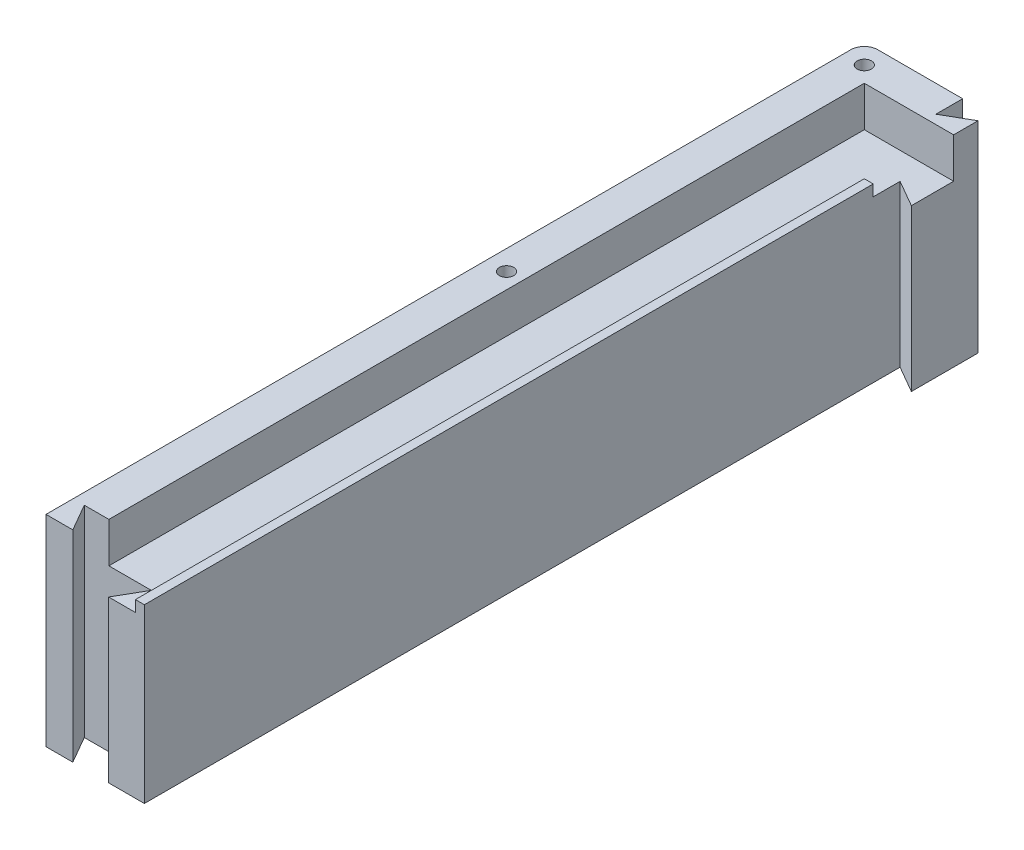
ISO-10303-21;
HEADER;
FILE_DESCRIPTION(('STEP AP214'),'2;1');
FILE_NAME('part.step','',(''),(''),'','','');
FILE_SCHEMA(('AUTOMOTIVE_DESIGN { 1 0 10303 214 1 1 1 1 }'));
ENDSEC;
DATA;
#1=APPLICATION_CONTEXT('core data for automotive mechanical design processes');
#2=APPLICATION_PROTOCOL_DEFINITION('international standard','automotive_design',2000,#1);
#3=PRODUCT_CONTEXT('',#1,'mechanical');
#4=PRODUCT('Part','Part','',(#3));
#5=PRODUCT_RELATED_PRODUCT_CATEGORY('part','',(#4));
#6=PRODUCT_DEFINITION_FORMATION('','',#4);
#7=PRODUCT_DEFINITION_CONTEXT('part definition',#1,'design');
#8=PRODUCT_DEFINITION('design','',#6,#7);
#9=PRODUCT_DEFINITION_SHAPE('','',#8);
#10=(LENGTH_UNIT() NAMED_UNIT(*) SI_UNIT(.MILLI.,.METRE.));
#11=(NAMED_UNIT(*) PLANE_ANGLE_UNIT() SI_UNIT($,.RADIAN.));
#12=(NAMED_UNIT(*) SI_UNIT($,.STERADIAN.) SOLID_ANGLE_UNIT());
#13=UNCERTAINTY_MEASURE_WITH_UNIT(LENGTH_MEASURE(1.E-05),#10,'distance_accuracy_value','');
#14=(GEOMETRIC_REPRESENTATION_CONTEXT(3) GLOBAL_UNCERTAINTY_ASSIGNED_CONTEXT((#13)) GLOBAL_UNIT_ASSIGNED_CONTEXT((#10,
#11,#12)) REPRESENTATION_CONTEXT('',''));
#15=CARTESIAN_POINT('',(0.,0.,0.));
#16=DIRECTION('',(0.,0.,1.));
#17=DIRECTION('',(1.,0.,0.));
#18=AXIS2_PLACEMENT_3D('',#15,#16,#17);
#19=CARTESIAN_POINT('',(0.,45.,0.));
#20=DIRECTION('',(0.,1.,0.));
#21=DIRECTION('',(0.,0.,1.));
#22=AXIS2_PLACEMENT_3D('',#19,#20,#21);
#23=PLANE('',#22);
#24=CARTESIAN_POINT('',(-3.53553390593273,45.,-273.535533905933));
#25=DIRECTION('',(0.,1.,0.));
#26=DIRECTION('',(0.,0.,1.));
#27=AXIS2_PLACEMENT_3D('',#24,#25,#26);
#28=CIRCLE('',#27,1.6);
#29=CARTESIAN_POINT('',(-3.53553390593273,45.,-271.935533905933));
#30=VERTEX_POINT('',#29);
#31=EDGE_CURVE('E201',#30,#30,#28,.T.);
#32=ORIENTED_EDGE('',*,*,#31,.F.);
#33=EDGE_LOOP('',(#32));
#34=FACE_BOUND('',#33,.T.);
#35=CARTESIAN_POINT('',(-3.53553390593274,45.,-353.535533905933));
#36=DIRECTION('',(0.,1.,0.));
#37=DIRECTION('',(0.,0.,1.));
#38=AXIS2_PLACEMENT_3D('',#35,#36,#37);
#39=CIRCLE('',#38,1.59999999999999);
#40=CARTESIAN_POINT('',(-3.53553390593274,45.,-351.935533905933));
#41=VERTEX_POINT('',#40);
#42=EDGE_CURVE('E285',#41,#41,#39,.T.);
#43=ORIENTED_EDGE('',*,*,#42,.F.);
#44=EDGE_LOOP('',(#43));
#45=FACE_BOUND('',#44,.T.);
#46=CARTESIAN_POINT('',(-5.,45.,-355.));
#47=DIRECTION('',(0.,1.,0.));
#48=DIRECTION('',(0.,0.,1.));
#49=AXIS2_PLACEMENT_3D('',#46,#47,#48);
#50=CIRCLE('',#49,3.00000000000004);
#51=CARTESIAN_POINT('',(-5.,45.,-358.));
#52=VERTEX_POINT('',#51);
#53=CARTESIAN_POINT('',(-8.00000000000003,45.,-355.));
#54=VERTEX_POINT('',#53);
#55=EDGE_CURVE('E198',#52,#54,#50,.T.);
#56=ORIENTED_EDGE('',*,*,#55,.T.);
#57=DIRECTION('',(0.,0.,1.));
#58=VECTOR('',#57,1.);
#59=CARTESIAN_POINT('',(-8.,45.,0.));
#60=LINE('',#59,#58);
#61=CARTESIAN_POINT('',(-8.,45.,-175.));
#62=VERTEX_POINT('',#61);
#63=EDGE_CURVE('E207',#54,#62,#60,.T.);
#64=ORIENTED_EDGE('',*,*,#63,.T.);
#65=DIRECTION('',(1.,0.,0.));
#66=VECTOR('',#65,1.);
#67=CARTESIAN_POINT('',(-6.07153216591882E-13,45.,-175.));
#68=LINE('',#67,#66);
#69=CARTESIAN_POINT('',(-2.,45.,-175.));
#70=VERTEX_POINT('',#69);
#71=EDGE_CURVE('E273',#62,#70,#68,.T.);
#72=ORIENTED_EDGE('',*,*,#71,.T.);
#73=DIRECTION('',(0.499999999999997,0.,0.86602540378444));
#74=VECTOR('',#73,1.);
#75=CARTESIAN_POINT('',(74.2772228311381,45.,-42.8839745962151));
#76=LINE('',#75,#74);
#77=CARTESIAN_POINT('',(-5.49999999999999,45.,-181.062177826491));
#78=VERTEX_POINT('',#77);
#79=EDGE_CURVE('E277',#78,#70,#76,.T.);
#80=ORIENTED_EDGE('',*,*,#79,.F.);
#81=DIRECTION('',(-1.,0.,0.));
#82=VECTOR('',#81,1.);
#83=CARTESIAN_POINT('',(0.,45.,-181.062177826491));
#84=LINE('',#83,#82);
#85=CARTESIAN_POINT('',(0.,45.,-181.062177826491));
#86=VERTEX_POINT('',#85);
#87=EDGE_CURVE('E263',#86,#78,#84,.T.);
#88=ORIENTED_EDGE('',*,*,#87,.F.);
#89=DIRECTION('',(0.,0.,-1.));
#90=VECTOR('',#89,1.);
#91=CARTESIAN_POINT('',(0.,45.,0.));
#92=LINE('',#91,#90);
#93=CARTESIAN_POINT('',(0.,45.,-350.));
#94=VERTEX_POINT('',#93);
#95=EDGE_CURVE('E305',#86,#94,#92,.T.);
#96=ORIENTED_EDGE('',*,*,#95,.T.);
#97=DIRECTION('',(1.,0.,0.));
#98=VECTOR('',#97,1.);
#99=CARTESIAN_POINT('',(0.,45.,-350.));
#100=LINE('',#99,#98);
#101=CARTESIAN_POINT('',(19.9755752861127,45.,-350.));
#102=VERTEX_POINT('',#101);
#103=EDGE_CURVE('E307',#94,#102,#100,.T.);
#104=ORIENTED_EDGE('',*,*,#103,.T.);
#105=DIRECTION('',(0.,0.,-1.));
#106=VECTOR('',#105,1.);
#107=CARTESIAN_POINT('',(19.9755752861127,45.,0.));
#108=LINE('',#107,#106);
#109=CARTESIAN_POINT('',(19.9755752861127,45.,-355.45));
#110=VERTEX_POINT('',#109);
#111=EDGE_CURVE('E175',#102,#110,#108,.T.);
#112=ORIENTED_EDGE('',*,*,#111,.T.);
#113=DIRECTION('',(-0.866025403784486,0.,0.499999999999919));
#114=VECTOR('',#113,1.);
#115=CARTESIAN_POINT('',(-148.920471066046,45.,-257.937822173539));
#116=LINE('',#115,#114);
#117=CARTESIAN_POINT('',(13.9999999999988,45.,-352.));
#118=VERTEX_POINT('',#117);
#119=EDGE_CURVE('E280',#110,#118,#116,.T.);
#120=ORIENTED_EDGE('',*,*,#119,.T.);
#121=DIRECTION('',(0.,0.,1.));
#122=VECTOR('',#121,1.);
#123=CARTESIAN_POINT('',(14.0000000000012,45.,0.));
#124=LINE('',#123,#122);
#125=CARTESIAN_POINT('',(13.9999999999987,45.,-358.));
#126=VERTEX_POINT('',#125);
#127=EDGE_CURVE('E275',#126,#118,#124,.T.);
#128=ORIENTED_EDGE('',*,*,#127,.F.);
#129=DIRECTION('',(-1.,0.,0.));
#130=VECTOR('',#129,1.);
#131=CARTESIAN_POINT('',(0.,45.,-358.));
#132=LINE('',#131,#130);
#133=EDGE_CURVE('E54',#126,#52,#132,.T.);
#134=ORIENTED_EDGE('',*,*,#133,.T.);
#135=EDGE_LOOP('',(#56,#64,#72,#80,#88,#96,#104,#112,#120,#128,#134));
#136=FACE_BOUND('',#135,.T.);
#137=ADVANCED_FACE('F38',(#34,#45,#136),#23,.T.);
#138=CARTESIAN_POINT('',(0.,0.,0.));
#139=DIRECTION('',(0.,1.,0.));
#140=DIRECTION('',(0.,0.,1.));
#141=AXIS2_PLACEMENT_3D('',#138,#139,#140);
#142=PLANE('',#141);
#143=CARTESIAN_POINT('',(-3.53553390593273,0.,-273.535533905933));
#144=DIRECTION('',(0.,1.,0.));
#145=DIRECTION('',(0.,0.,1.));
#146=AXIS2_PLACEMENT_3D('',#143,#144,#145);
#147=CIRCLE('',#146,1.6);
#148=CARTESIAN_POINT('',(-3.53553390593273,0.,-271.935533905933));
#149=VERTEX_POINT('',#148);
#150=EDGE_CURVE('E42',#149,#149,#147,.T.);
#151=ORIENTED_EDGE('',*,*,#150,.T.);
#152=EDGE_LOOP('',(#151));
#153=FACE_BOUND('',#152,.T.);
#154=CARTESIAN_POINT('',(-3.53553390593274,0.,-353.535533905933));
#155=DIRECTION('',(0.,1.,0.));
#156=DIRECTION('',(0.,0.,1.));
#157=AXIS2_PLACEMENT_3D('',#154,#155,#156);
#158=CIRCLE('',#157,1.59999999999999);
#159=CARTESIAN_POINT('',(-3.53553390593274,0.,-351.935533905933));
#160=VERTEX_POINT('',#159);
#161=EDGE_CURVE('E288',#160,#160,#158,.T.);
#162=ORIENTED_EDGE('',*,*,#161,.T.);
#163=EDGE_LOOP('',(#162));
#164=FACE_BOUND('',#163,.T.);
#165=DIRECTION('',(0.,0.,1.));
#166=VECTOR('',#165,1.);
#167=CARTESIAN_POINT('',(-8.,0.,0.));
#168=LINE('',#167,#166);
#169=CARTESIAN_POINT('',(-8.00000000000003,0.,-355.));
#170=VERTEX_POINT('',#169);
#171=CARTESIAN_POINT('',(-8.,0.,-175.));
#172=VERTEX_POINT('',#171);
#173=EDGE_CURVE('E216',#170,#172,#168,.T.);
#174=ORIENTED_EDGE('',*,*,#173,.F.);
#175=CARTESIAN_POINT('',(-5.,0.,-355.));
#176=DIRECTION('',(0.,1.,0.));
#177=DIRECTION('',(0.,0.,1.));
#178=AXIS2_PLACEMENT_3D('',#175,#176,#177);
#179=CIRCLE('',#178,3.00000000000004);
#180=CARTESIAN_POINT('',(-5.,0.,-358.));
#181=VERTEX_POINT('',#180);
#182=EDGE_CURVE('E11',#181,#170,#179,.T.);
#183=ORIENTED_EDGE('',*,*,#182,.F.);
#184=DIRECTION('',(-1.,0.,0.));
#185=VECTOR('',#184,1.);
#186=CARTESIAN_POINT('',(0.,0.,-358.));
#187=LINE('',#186,#185);
#188=CARTESIAN_POINT('',(13.9999999999987,0.,-358.));
#189=VERTEX_POINT('',#188);
#190=EDGE_CURVE('E213',#189,#181,#187,.T.);
#191=ORIENTED_EDGE('',*,*,#190,.F.);
#192=DIRECTION('',(0.,0.,-1.));
#193=VECTOR('',#192,1.);
#194=CARTESIAN_POINT('',(14.0000000000012,0.,0.));
#195=LINE('',#194,#193);
#196=CARTESIAN_POINT('',(13.9999999999988,0.,-352.));
#197=VERTEX_POINT('',#196);
#198=EDGE_CURVE('E231',#197,#189,#195,.T.);
#199=ORIENTED_EDGE('',*,*,#198,.F.);
#200=DIRECTION('',(0.866025403784486,0.,-0.499999999999919));
#201=VECTOR('',#200,1.);
#202=CARTESIAN_POINT('',(-148.920471066046,0.,-257.937822173539));
#203=LINE('',#202,#201);
#204=CARTESIAN_POINT('',(19.9755752861127,0.,-355.45));
#205=VERTEX_POINT('',#204);
#206=EDGE_CURVE('E235',#197,#205,#203,.T.);
#207=ORIENTED_EDGE('',*,*,#206,.T.);
#208=DIRECTION('',(0.,0.,1.));
#209=VECTOR('',#208,1.);
#210=CARTESIAN_POINT('',(19.9755752861127,0.,0.));
#211=LINE('',#210,#209);
#212=CARTESIAN_POINT('',(19.9755752861127,0.,-340.55));
#213=VERTEX_POINT('',#212);
#214=EDGE_CURVE('E239',#205,#213,#211,.T.);
#215=ORIENTED_EDGE('',*,*,#214,.T.);
#216=DIRECTION('',(-0.866025403784487,0.,-0.499999999999916));
#217=VECTOR('',#216,1.);
#218=CARTESIAN_POINT('',(152.456369450905,0.,-264.062177826519));
#219=LINE('',#218,#217);
#220=CARTESIAN_POINT('',(13.9999999999988,0.,-344.));
#221=VERTEX_POINT('',#220);
#222=EDGE_CURVE('E236',#213,#221,#219,.T.);
#223=ORIENTED_EDGE('',*,*,#222,.T.);
#224=DIRECTION('',(0.,0.,-1.));
#225=VECTOR('',#224,1.);
#226=CARTESIAN_POINT('',(14.,0.,-336.));
#227=LINE('',#226,#225);
#228=CARTESIAN_POINT('',(14.,0.,-175.));
#229=VERTEX_POINT('',#228);
#230=EDGE_CURVE('E283',#229,#221,#227,.T.);
#231=ORIENTED_EDGE('',*,*,#230,.F.);
#232=DIRECTION('',(-1.,0.,0.));
#233=VECTOR('',#232,1.);
#234=CARTESIAN_POINT('',(-6.07153216591882E-13,0.,-175.));
#235=LINE('',#234,#233);
#236=CARTESIAN_POINT('',(6.00000000000002,0.,-175.));
#237=VERTEX_POINT('',#236);
#238=EDGE_CURVE('E222',#229,#237,#235,.T.);
#239=ORIENTED_EDGE('',*,*,#238,.T.);
#240=DIRECTION('',(-0.499999999999997,0.,0.86602540378444));
#241=VECTOR('',#240,1.);
#242=CARTESIAN_POINT('',(-71.277222831138,0.,-41.1519237886462));
#243=LINE('',#242,#241);
#244=CARTESIAN_POINT('',(9.50000000000001,0.,-181.062177826491));
#245=VERTEX_POINT('',#244);
#246=EDGE_CURVE('E228',#245,#237,#243,.T.);
#247=ORIENTED_EDGE('',*,*,#246,.F.);
#248=DIRECTION('',(1.,0.,0.));
#249=VECTOR('',#248,1.);
#250=CARTESIAN_POINT('',(0.,0.,-181.062177826491));
#251=LINE('',#250,#249);
#252=CARTESIAN_POINT('',(-5.49999999999999,0.,-181.062177826491));
#253=VERTEX_POINT('',#252);
#254=EDGE_CURVE('E225',#253,#245,#251,.T.);
#255=ORIENTED_EDGE('',*,*,#254,.F.);
#256=DIRECTION('',(-0.499999999999997,0.,-0.86602540378444));
#257=VECTOR('',#256,1.);
#258=CARTESIAN_POINT('',(74.2772228311381,0.,-42.8839745962151));
#259=LINE('',#258,#257);
#260=CARTESIAN_POINT('',(-2.,0.,-175.));
#261=VERTEX_POINT('',#260);
#262=EDGE_CURVE('E221',#261,#253,#259,.T.);
#263=ORIENTED_EDGE('',*,*,#262,.F.);
#264=EDGE_CURVE('E218',#261,#172,#235,.T.);
#265=ORIENTED_EDGE('',*,*,#264,.T.);
#266=EDGE_LOOP('',(#174,#183,#191,#199,#207,#215,#223,#231,#239,#247,#255,#263,#265));
#267=FACE_BOUND('',#266,.T.);
#268=ADVANCED_FACE('F336',(#153,#164,#267),#142,.F.);
#269=CARTESIAN_POINT('',(-6.07153216591882E-13,126.5,-175.));
#270=DIRECTION('',(0.,0.,1.));
#271=DIRECTION('',(1.,0.,0.));
#272=AXIS2_PLACEMENT_3D('',#269,#270,#271);
#273=PLANE('',#272);
#274=ORIENTED_EDGE('',*,*,#71,.F.);
#275=DIRECTION('',(0.,-1.,0.));
#276=VECTOR('',#275,1.);
#277=CARTESIAN_POINT('',(-8.,126.5,-175.));
#278=LINE('',#277,#276);
#279=EDGE_CURVE('E47',#62,#172,#278,.T.);
#280=ORIENTED_EDGE('',*,*,#279,.T.);
#281=ORIENTED_EDGE('',*,*,#264,.F.);
#282=DIRECTION('',(0.,-1.,0.));
#283=VECTOR('',#282,1.);
#284=CARTESIAN_POINT('',(-2.,126.5,-175.));
#285=LINE('',#284,#283);
#286=EDGE_CURVE('E234',#70,#261,#285,.T.);
#287=ORIENTED_EDGE('',*,*,#286,.F.);
#288=EDGE_LOOP('',(#274,#280,#281,#287));
#289=FACE_BOUND('',#288,.T.);
#290=ADVANCED_FACE('F329',(#289),#273,.T.);
#291=CARTESIAN_POINT('',(14.0000000000012,126.5,0.));
#292=DIRECTION('',(-1.,0.,0.));
#293=DIRECTION('',(0.,0.,1.));
#294=AXIS2_PLACEMENT_3D('',#291,#292,#293);
#295=PLANE('',#294);
#296=DIRECTION('',(0.,-1.,0.));
#297=VECTOR('',#296,1.);
#298=CARTESIAN_POINT('',(13.9999999999987,126.5,-358.));
#299=LINE('',#298,#297);
#300=EDGE_CURVE('E190',#126,#189,#299,.T.);
#301=ORIENTED_EDGE('',*,*,#300,.F.);
#302=ORIENTED_EDGE('',*,*,#127,.T.);
#303=DIRECTION('',(0.,-1.,0.));
#304=VECTOR('',#303,1.);
#305=CARTESIAN_POINT('',(13.9999999999988,126.5,-352.));
#306=LINE('',#305,#304);
#307=EDGE_CURVE('E244',#118,#197,#306,.T.);
#308=ORIENTED_EDGE('',*,*,#307,.T.);
#309=ORIENTED_EDGE('',*,*,#198,.T.);
#310=EDGE_LOOP('',(#301,#302,#308,#309));
#311=FACE_BOUND('',#310,.T.);
#312=ADVANCED_FACE('F356',(#311),#295,.F.);
#313=CARTESIAN_POINT('',(0.,45.,-350.));
#314=DIRECTION('',(0.,0.,-1.));
#315=DIRECTION('',(-1.,0.,0.));
#316=AXIS2_PLACEMENT_3D('',#313,#314,#315);
#317=PLANE('',#316);
#318=DIRECTION('',(0.,-1.,0.));
#319=VECTOR('',#318,1.);
#320=CARTESIAN_POINT('',(19.9755752861127,45.,-350.));
#321=LINE('',#320,#319);
#322=CARTESIAN_POINT('',(19.9755752861127,36.,-350.));
#323=VERTEX_POINT('',#322);
#324=EDGE_CURVE('E168',#102,#323,#321,.T.);
#325=ORIENTED_EDGE('',*,*,#324,.F.);
#326=ORIENTED_EDGE('',*,*,#103,.F.);
#327=DIRECTION('',(0.,-1.,0.));
#328=VECTOR('',#327,1.);
#329=CARTESIAN_POINT('',(0.,45.,-350.));
#330=LINE('',#329,#328);
#331=CARTESIAN_POINT('',(0.,36.,-350.));
#332=VERTEX_POINT('',#331);
#333=EDGE_CURVE('E194',#94,#332,#330,.T.);
#334=ORIENTED_EDGE('',*,*,#333,.T.);
#335=DIRECTION('',(-1.,0.,0.));
#336=VECTOR('',#335,1.);
#337=CARTESIAN_POINT('',(19.9755752861127,36.,-350.));
#338=LINE('',#337,#336);
#339=EDGE_CURVE('E187',#323,#332,#338,.T.);
#340=ORIENTED_EDGE('',*,*,#339,.F.);
#341=EDGE_LOOP('',(#325,#326,#334,#340));
#342=FACE_BOUND('',#341,.T.);
#343=ADVANCED_FACE('F192',(#342),#317,.F.);
#344=CARTESIAN_POINT('',(14.,33.5,-14.));
#345=DIRECTION('',(-1.,0.,0.));
#346=DIRECTION('',(0.,0.,1.));
#347=AXIS2_PLACEMENT_3D('',#344,#345,#346);
#348=PLANE('',#347);
#349=DIRECTION('',(0.,-1.,0.));
#350=VECTOR('',#349,1.);
#351=CARTESIAN_POINT('',(14.,126.5,-175.));
#352=LINE('',#351,#350);
#353=CARTESIAN_POINT('',(14.,38.5,-175.));
#354=VERTEX_POINT('',#353);
#355=EDGE_CURVE('E252',#354,#229,#352,.T.);
#356=ORIENTED_EDGE('',*,*,#355,.T.);
#357=ORIENTED_EDGE('',*,*,#230,.T.);
#358=DIRECTION('',(0.,-1.,0.));
#359=VECTOR('',#358,1.);
#360=CARTESIAN_POINT('',(13.9999999999988,126.5,-344.));
#361=LINE('',#360,#359);
#362=CARTESIAN_POINT('',(13.9999999999988,36.,-344.));
#363=VERTEX_POINT('',#362);
#364=EDGE_CURVE('E62',#363,#221,#361,.T.);
#365=ORIENTED_EDGE('',*,*,#364,.F.);
#366=DIRECTION('',(0.,0.,1.));
#367=VECTOR('',#366,1.);
#368=CARTESIAN_POINT('',(14.0000000000012,36.,0.));
#369=LINE('',#368,#367);
#370=CARTESIAN_POINT('',(13.9999999999989,36.,-338.));
#371=VERTEX_POINT('',#370);
#372=EDGE_CURVE('E321',#363,#371,#369,.T.);
#373=ORIENTED_EDGE('',*,*,#372,.T.);
#374=DIRECTION('',(0.,1.,0.));
#375=VECTOR('',#374,1.);
#376=CARTESIAN_POINT('',(13.9999999999989,36.,-338.));
#377=LINE('',#376,#375);
#378=CARTESIAN_POINT('',(13.9999999999989,38.5,-338.));
#379=VERTEX_POINT('',#378);
#380=EDGE_CURVE('E180',#371,#379,#377,.T.);
#381=ORIENTED_EDGE('',*,*,#380,.T.);
#382=DIRECTION('',(0.,0.,1.));
#383=VECTOR('',#382,1.);
#384=CARTESIAN_POINT('',(14.,38.5,-14.));
#385=LINE('',#384,#383);
#386=EDGE_CURVE('E302',#379,#354,#385,.T.);
#387=ORIENTED_EDGE('',*,*,#386,.T.);
#388=EDGE_LOOP('',(#356,#357,#365,#373,#381,#387));
#389=FACE_BOUND('',#388,.T.);
#390=ADVANCED_FACE('F370',(#389),#348,.F.);
#391=CARTESIAN_POINT('',(12.,36.,0.));
#392=DIRECTION('',(-1.,0.,0.));
#393=DIRECTION('',(0.,0.,1.));
#394=AXIS2_PLACEMENT_3D('',#391,#392,#393);
#395=PLANE('',#394);
#396=DIRECTION('',(0.,0.,1.));
#397=VECTOR('',#396,1.);
#398=CARTESIAN_POINT('',(12.,36.,0.));
#399=LINE('',#398,#397);
#400=CARTESIAN_POINT('',(12.,36.,-338.));
#401=VERTEX_POINT('',#400);
#402=CARTESIAN_POINT('',(12.,36.,-175.));
#403=VERTEX_POINT('',#402);
#404=EDGE_CURVE('E289',#401,#403,#399,.T.);
#405=ORIENTED_EDGE('',*,*,#404,.T.);
#406=DIRECTION('',(0.,1.,0.));
#407=VECTOR('',#406,1.);
#408=CARTESIAN_POINT('',(12.,36.,-175.));
#409=LINE('',#408,#407);
#410=CARTESIAN_POINT('',(12.,38.5,-175.));
#411=VERTEX_POINT('',#410);
#412=EDGE_CURVE('E265',#403,#411,#409,.T.);
#413=ORIENTED_EDGE('',*,*,#412,.T.);
#414=DIRECTION('',(0.,0.,1.));
#415=VECTOR('',#414,1.);
#416=CARTESIAN_POINT('',(12.,38.5,0.));
#417=LINE('',#416,#415);
#418=CARTESIAN_POINT('',(12.,38.5,-338.));
#419=VERTEX_POINT('',#418);
#420=EDGE_CURVE('E296',#419,#411,#417,.T.);
#421=ORIENTED_EDGE('',*,*,#420,.F.);
#422=DIRECTION('',(0.,1.,0.));
#423=VECTOR('',#422,1.);
#424=CARTESIAN_POINT('',(12.,36.,-338.));
#425=LINE('',#424,#423);
#426=EDGE_CURVE('E295',#401,#419,#425,.T.);
#427=ORIENTED_EDGE('',*,*,#426,.F.);
#428=EDGE_LOOP('',(#405,#413,#421,#427));
#429=FACE_BOUND('',#428,.T.);
#430=ADVANCED_FACE('F391',(#429),#395,.T.);
#431=CARTESIAN_POINT('',(0.,36.,0.));
#432=DIRECTION('',(0.,1.,0.));
#433=DIRECTION('',(0.,0.,1.));
#434=AXIS2_PLACEMENT_3D('',#431,#432,#433);
#435=PLANE('',#434);
#436=DIRECTION('',(0.866025403784487,0.,0.499999999999916));
#437=VECTOR('',#436,1.);
#438=CARTESIAN_POINT('',(152.456369450905,36.,-264.062177826519));
#439=LINE('',#438,#437);
#440=CARTESIAN_POINT('',(19.9755752861127,36.,-340.55));
#441=VERTEX_POINT('',#440);
#442=EDGE_CURVE('E189',#363,#441,#439,.T.);
#443=ORIENTED_EDGE('',*,*,#442,.T.);
#444=DIRECTION('',(0.,0.,-1.));
#445=VECTOR('',#444,1.);
#446=CARTESIAN_POINT('',(19.9755752861127,36.,0.));
#447=LINE('',#446,#445);
#448=EDGE_CURVE('E171',#441,#323,#447,.T.);
#449=ORIENTED_EDGE('',*,*,#448,.T.);
#450=ORIENTED_EDGE('',*,*,#339,.T.);
#451=DIRECTION('',(0.,0.,1.));
#452=VECTOR('',#451,1.);
#453=CARTESIAN_POINT('',(0.,36.,-350.));
#454=LINE('',#453,#452);
#455=CARTESIAN_POINT('',(0.,36.,-181.062177826491));
#456=VERTEX_POINT('',#455);
#457=EDGE_CURVE('E196',#332,#456,#454,.T.);
#458=ORIENTED_EDGE('',*,*,#457,.T.);
#459=DIRECTION('',(-1.,0.,0.));
#460=VECTOR('',#459,1.);
#461=CARTESIAN_POINT('',(0.,36.,-181.062177826491));
#462=LINE('',#461,#460);
#463=CARTESIAN_POINT('',(9.50000000000001,36.,-181.062177826491));
#464=VERTEX_POINT('',#463);
#465=EDGE_CURVE('E310',#464,#456,#462,.T.);
#466=ORIENTED_EDGE('',*,*,#465,.F.);
#467=DIRECTION('',(0.499999999999997,0.,-0.86602540378444));
#468=VECTOR('',#467,1.);
#469=CARTESIAN_POINT('',(-71.277222831138,36.,-41.1519237886462));
#470=LINE('',#469,#468);
#471=CARTESIAN_POINT('',(6.00000000000002,36.,-175.));
#472=VERTEX_POINT('',#471);
#473=EDGE_CURVE('E315',#472,#464,#470,.T.);
#474=ORIENTED_EDGE('',*,*,#473,.F.);
#475=DIRECTION('',(1.,0.,0.));
#476=VECTOR('',#475,1.);
#477=CARTESIAN_POINT('',(-6.07153216591882E-13,36.,-175.));
#478=LINE('',#477,#476);
#479=EDGE_CURVE('E318',#472,#403,#478,.T.);
#480=ORIENTED_EDGE('',*,*,#479,.T.);
#481=ORIENTED_EDGE('',*,*,#404,.F.);
#482=DIRECTION('',(-1.,0.,0.));
#483=VECTOR('',#482,1.);
#484=CARTESIAN_POINT('',(0.,36.,-338.));
#485=LINE('',#484,#483);
#486=EDGE_CURVE('E292',#371,#401,#485,.T.);
#487=ORIENTED_EDGE('',*,*,#486,.F.);
#488=ORIENTED_EDGE('',*,*,#372,.F.);
#489=EDGE_LOOP('',(#443,#449,#450,#458,#466,#474,#480,#481,#487,#488));
#490=FACE_BOUND('',#489,.T.);
#491=ADVANCED_FACE('F185',(#490),#435,.T.);
#492=CARTESIAN_POINT('',(0.,38.5,0.));
#493=DIRECTION('',(0.,-1.,0.));
#494=DIRECTION('',(0.,0.,-1.));
#495=AXIS2_PLACEMENT_3D('',#492,#493,#494);
#496=PLANE('',#495);
#497=ORIENTED_EDGE('',*,*,#386,.F.);
#498=DIRECTION('',(-1.,0.,0.));
#499=VECTOR('',#498,1.);
#500=CARTESIAN_POINT('',(0.,38.5,-338.));
#501=LINE('',#500,#499);
#502=EDGE_CURVE('E293',#379,#419,#501,.T.);
#503=ORIENTED_EDGE('',*,*,#502,.T.);
#504=ORIENTED_EDGE('',*,*,#420,.T.);
#505=DIRECTION('',(-1.,0.,0.));
#506=VECTOR('',#505,1.);
#507=CARTESIAN_POINT('',(-6.07153216591882E-13,38.5,-175.));
#508=LINE('',#507,#506);
#509=EDGE_CURVE('E268',#354,#411,#508,.T.);
#510=ORIENTED_EDGE('',*,*,#509,.F.);
#511=EDGE_LOOP('',(#497,#503,#504,#510));
#512=FACE_BOUND('',#511,.T.);
#513=ADVANCED_FACE('F377',(#512),#496,.F.);
#514=CARTESIAN_POINT('',(0.,45.,0.));
#515=DIRECTION('',(-1.,0.,0.));
#516=DIRECTION('',(0.,0.,1.));
#517=AXIS2_PLACEMENT_3D('',#514,#515,#516);
#518=PLANE('',#517);
#519=ORIENTED_EDGE('',*,*,#95,.F.);
#520=DIRECTION('',(0.,-1.,0.));
#521=VECTOR('',#520,1.);
#522=CARTESIAN_POINT('',(0.,45.,-181.062177826491));
#523=LINE('',#522,#521);
#524=EDGE_CURVE('E246',#86,#456,#523,.T.);
#525=ORIENTED_EDGE('',*,*,#524,.T.);
#526=ORIENTED_EDGE('',*,*,#457,.F.);
#527=ORIENTED_EDGE('',*,*,#333,.F.);
#528=EDGE_LOOP('',(#519,#525,#526,#527));
#529=FACE_BOUND('',#528,.T.);
#530=ADVANCED_FACE('F40',(#529),#518,.F.);
#531=CARTESIAN_POINT('',(0.,36.,-338.));
#532=DIRECTION('',(0.,0.,-1.));
#533=DIRECTION('',(-1.,0.,0.));
#534=AXIS2_PLACEMENT_3D('',#531,#532,#533);
#535=PLANE('',#534);
#536=ORIENTED_EDGE('',*,*,#380,.F.);
#537=ORIENTED_EDGE('',*,*,#486,.T.);
#538=ORIENTED_EDGE('',*,*,#426,.T.);
#539=ORIENTED_EDGE('',*,*,#502,.F.);
#540=EDGE_LOOP('',(#536,#537,#538,#539));
#541=FACE_BOUND('',#540,.T.);
#542=ADVANCED_FACE('F373',(#541),#535,.T.);
#543=CARTESIAN_POINT('',(-3.53553390593274,-64.5,-353.535533905933));
#544=DIRECTION('',(0.,1.,0.));
#545=DIRECTION('',(0.,0.,1.));
#546=AXIS2_PLACEMENT_3D('',#543,#544,#545);
#547=CYLINDRICAL_SURFACE('',#546,1.59999999999999);
#548=ORIENTED_EDGE('',*,*,#42,.T.);
#549=EDGE_LOOP('',(#548));
#550=FACE_BOUND('',#549,.T.);
#551=ORIENTED_EDGE('',*,*,#161,.F.);
#552=EDGE_LOOP('',(#551));
#553=FACE_BOUND('',#552,.T.);
#554=ADVANCED_FACE('F435',(#550,#553),#547,.F.);
#555=CARTESIAN_POINT('',(0.,126.5,-181.062177826491));
#556=DIRECTION('',(0.,0.,-1.));
#557=DIRECTION('',(-1.,0.,0.));
#558=AXIS2_PLACEMENT_3D('',#555,#556,#557);
#559=PLANE('',#558);
#560=ORIENTED_EDGE('',*,*,#465,.T.);
#561=ORIENTED_EDGE('',*,*,#524,.F.);
#562=ORIENTED_EDGE('',*,*,#87,.T.);
#563=DIRECTION('',(0.,-1.,0.));
#564=VECTOR('',#563,1.);
#565=CARTESIAN_POINT('',(-5.49999999999999,126.5,-181.062177826491));
#566=LINE('',#565,#564);
#567=EDGE_CURVE('E259',#78,#253,#566,.T.);
#568=ORIENTED_EDGE('',*,*,#567,.T.);
#569=ORIENTED_EDGE('',*,*,#254,.T.);
#570=DIRECTION('',(0.,-1.,0.));
#571=VECTOR('',#570,1.);
#572=CARTESIAN_POINT('',(9.50000000000001,126.5,-181.062177826491));
#573=LINE('',#572,#571);
#574=EDGE_CURVE('E257',#464,#245,#573,.T.);
#575=ORIENTED_EDGE('',*,*,#574,.F.);
#576=EDGE_LOOP('',(#560,#561,#562,#568,#569,#575));
#577=FACE_BOUND('',#576,.T.);
#578=ADVANCED_FACE('F388',(#577),#559,.F.);
#579=CARTESIAN_POINT('',(-71.277222831138,126.5,-41.1519237886462));
#580=DIRECTION('',(0.86602540378444,0.,0.499999999999997));
#581=DIRECTION('',(0.499999999999997,0.,-0.86602540378444));
#582=AXIS2_PLACEMENT_3D('',#579,#580,#581);
#583=PLANE('',#582);
#584=ORIENTED_EDGE('',*,*,#473,.T.);
#585=ORIENTED_EDGE('',*,*,#574,.T.);
#586=ORIENTED_EDGE('',*,*,#246,.T.);
#587=DIRECTION('',(0.,-1.,0.));
#588=VECTOR('',#587,1.);
#589=CARTESIAN_POINT('',(6.00000000000002,126.5,-175.));
#590=LINE('',#589,#588);
#591=EDGE_CURVE('E255',#472,#237,#590,.T.);
#592=ORIENTED_EDGE('',*,*,#591,.F.);
#593=EDGE_LOOP('',(#584,#585,#586,#592));
#594=FACE_BOUND('',#593,.T.);
#595=ADVANCED_FACE('F385',(#594),#583,.F.);
#596=ORIENTED_EDGE('',*,*,#509,.T.);
#597=ORIENTED_EDGE('',*,*,#412,.F.);
#598=ORIENTED_EDGE('',*,*,#479,.F.);
#599=ORIENTED_EDGE('',*,*,#591,.T.);
#600=ORIENTED_EDGE('',*,*,#238,.F.);
#601=ORIENTED_EDGE('',*,*,#355,.F.);
#602=EDGE_LOOP('',(#596,#597,#598,#599,#600,#601));
#603=FACE_BOUND('',#602,.T.);
#604=ADVANCED_FACE('F381',(#603),#273,.T.);
#605=CARTESIAN_POINT('',(74.2772228311381,126.5,-42.8839745962151));
#606=DIRECTION('',(-0.86602540378444,0.,0.499999999999997));
#607=DIRECTION('',(0.499999999999997,0.,0.86602540378444));
#608=AXIS2_PLACEMENT_3D('',#605,#606,#607);
#609=PLANE('',#608);
#610=ORIENTED_EDGE('',*,*,#79,.T.);
#611=ORIENTED_EDGE('',*,*,#286,.T.);
#612=ORIENTED_EDGE('',*,*,#262,.T.);
#613=ORIENTED_EDGE('',*,*,#567,.F.);
#614=EDGE_LOOP('',(#610,#611,#612,#613));
#615=FACE_BOUND('',#614,.T.);
#616=ADVANCED_FACE('F342',(#615),#609,.F.);
#617=CARTESIAN_POINT('',(-148.920471066046,126.5,-257.937822173539));
#618=DIRECTION('',(-0.499999999999919,0.,-0.866025403784485));
#619=DIRECTION('',(-0.866025403784486,0.,0.499999999999919));
#620=AXIS2_PLACEMENT_3D('',#617,#618,#619);
#621=PLANE('',#620);
#622=DIRECTION('',(0.,-1.,0.));
#623=VECTOR('',#622,1.);
#624=CARTESIAN_POINT('',(19.9755752861127,126.5,-355.45));
#625=LINE('',#624,#623);
#626=EDGE_CURVE('E247',#110,#205,#625,.T.);
#627=ORIENTED_EDGE('',*,*,#626,.T.);
#628=ORIENTED_EDGE('',*,*,#206,.F.);
#629=ORIENTED_EDGE('',*,*,#307,.F.);
#630=ORIENTED_EDGE('',*,*,#119,.F.);
#631=EDGE_LOOP('',(#627,#628,#629,#630));
#632=FACE_BOUND('',#631,.T.);
#633=ADVANCED_FACE('F361',(#632),#621,.T.);
#634=CARTESIAN_POINT('',(19.9755752861127,126.5,0.));
#635=DIRECTION('',(1.,0.,0.));
#636=DIRECTION('',(0.,0.,-1.));
#637=AXIS2_PLACEMENT_3D('',#634,#635,#636);
#638=PLANE('',#637);
#639=ORIENTED_EDGE('',*,*,#324,.T.);
#640=ORIENTED_EDGE('',*,*,#448,.F.);
#641=DIRECTION('',(0.,-1.,0.));
#642=VECTOR('',#641,1.);
#643=CARTESIAN_POINT('',(19.9755752861127,126.5,-340.55));
#644=LINE('',#643,#642);
#645=EDGE_CURVE('E249',#441,#213,#644,.T.);
#646=ORIENTED_EDGE('',*,*,#645,.T.);
#647=ORIENTED_EDGE('',*,*,#214,.F.);
#648=ORIENTED_EDGE('',*,*,#626,.F.);
#649=ORIENTED_EDGE('',*,*,#111,.F.);
#650=EDGE_LOOP('',(#639,#640,#646,#647,#648,#649));
#651=FACE_BOUND('',#650,.T.);
#652=ADVANCED_FACE('F170',(#651),#638,.T.);
#653=CARTESIAN_POINT('',(152.456369450905,126.5,-264.062177826519));
#654=DIRECTION('',(-0.499999999999916,0.,0.866025403784487));
#655=DIRECTION('',(0.866025403784487,0.,0.499999999999916));
#656=AXIS2_PLACEMENT_3D('',#653,#654,#655);
#657=PLANE('',#656);
#658=ORIENTED_EDGE('',*,*,#364,.T.);
#659=ORIENTED_EDGE('',*,*,#222,.F.);
#660=ORIENTED_EDGE('',*,*,#645,.F.);
#661=ORIENTED_EDGE('',*,*,#442,.F.);
#662=EDGE_LOOP('',(#658,#659,#660,#661));
#663=FACE_BOUND('',#662,.T.);
#664=ADVANCED_FACE('F366',(#663),#657,.T.);
#665=CARTESIAN_POINT('',(-5.,-1.00000000000001,-355.));
#666=DIRECTION('',(0.,1.,0.));
#667=DIRECTION('',(0.,0.,1.));
#668=AXIS2_PLACEMENT_3D('',#665,#666,#667);
#669=CYLINDRICAL_SURFACE('',#668,3.00000000000004);
#670=ORIENTED_EDGE('',*,*,#182,.T.);
#671=DIRECTION('',(0.,1.,0.));
#672=VECTOR('',#671,1.);
#673=CARTESIAN_POINT('',(-8.00000000000003,-1.00000000000001,-355.));
#674=LINE('',#673,#672);
#675=EDGE_CURVE('E211',#170,#54,#674,.T.);
#676=ORIENTED_EDGE('',*,*,#675,.T.);
#677=ORIENTED_EDGE('',*,*,#55,.F.);
#678=DIRECTION('',(0.,1.,0.));
#679=VECTOR('',#678,1.);
#680=CARTESIAN_POINT('',(-5.,-1.00000000000001,-358.));
#681=LINE('',#680,#679);
#682=EDGE_CURVE('E210',#181,#52,#681,.T.);
#683=ORIENTED_EDGE('',*,*,#682,.F.);
#684=EDGE_LOOP('',(#670,#676,#677,#683));
#685=FACE_BOUND('',#684,.T.);
#686=ADVANCED_FACE('F351',(#685),#669,.T.);
#687=CARTESIAN_POINT('',(-8.,-1.00000000000001,0.));
#688=DIRECTION('',(-1.,0.,0.));
#689=DIRECTION('',(0.,0.,1.));
#690=AXIS2_PLACEMENT_3D('',#687,#688,#689);
#691=PLANE('',#690);
#692=ORIENTED_EDGE('',*,*,#173,.T.);
#693=ORIENTED_EDGE('',*,*,#279,.F.);
#694=ORIENTED_EDGE('',*,*,#63,.F.);
#695=ORIENTED_EDGE('',*,*,#675,.F.);
#696=EDGE_LOOP('',(#692,#693,#694,#695));
#697=FACE_BOUND('',#696,.T.);
#698=ADVANCED_FACE('F349',(#697),#691,.T.);
#699=CARTESIAN_POINT('',(0.,-1.00000000000001,-358.));
#700=DIRECTION('',(0.,0.,-1.));
#701=DIRECTION('',(-1.,0.,0.));
#702=AXIS2_PLACEMENT_3D('',#699,#700,#701);
#703=PLANE('',#702);
#704=ORIENTED_EDGE('',*,*,#190,.T.);
#705=ORIENTED_EDGE('',*,*,#682,.T.);
#706=ORIENTED_EDGE('',*,*,#133,.F.);
#707=ORIENTED_EDGE('',*,*,#300,.T.);
#708=EDGE_LOOP('',(#704,#705,#706,#707));
#709=FACE_BOUND('',#708,.T.);
#710=ADVANCED_FACE('F499',(#709),#703,.T.);
#711=CARTESIAN_POINT('',(-3.53553390593273,-30.5,-273.535533905933));
#712=DIRECTION('',(0.,1.,0.));
#713=DIRECTION('',(0.,0.,1.));
#714=AXIS2_PLACEMENT_3D('',#711,#712,#713);
#715=CYLINDRICAL_SURFACE('',#714,1.6);
#716=ORIENTED_EDGE('',*,*,#31,.T.);
#717=EDGE_LOOP('',(#716));
#718=FACE_BOUND('',#717,.T.);
#719=ORIENTED_EDGE('',*,*,#150,.F.);
#720=EDGE_LOOP('',(#719));
#721=FACE_BOUND('',#720,.T.);
#722=ADVANCED_FACE('F496',(#718,#721),#715,.F.);
#723=CLOSED_SHELL('',(#137,#268,#290,#312,#343,#390,#430,#491,#513,#530,#542,#554,#578,#595,
#604,#616,#633,#652,#664,#686,#698,#710,#722));
#724=MANIFOLD_SOLID_BREP('B2',#723);
#725=ADVANCED_BREP_SHAPE_REPRESENTATION('',(#18,#724),#14);
#726=SHAPE_DEFINITION_REPRESENTATION(#9,#725);
ENDSEC;
END-ISO-10303-21;
